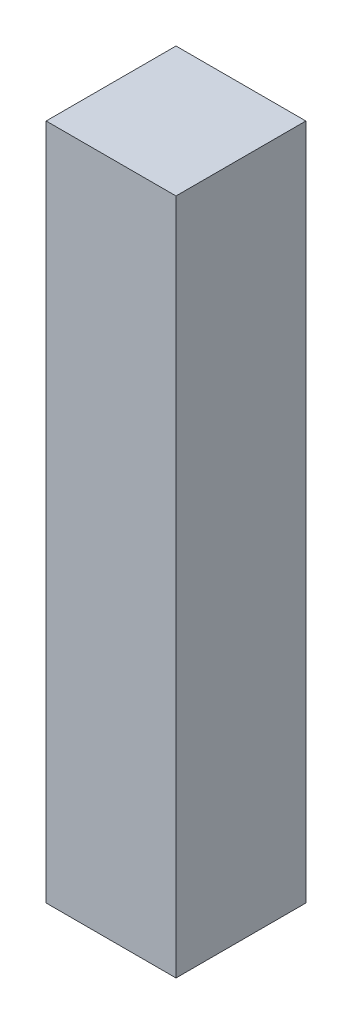
ISO-10303-21;
HEADER;
FILE_DESCRIPTION(('STEP AP214'),'2;1');
FILE_NAME('part.step','',(''),(''),'','','');
FILE_SCHEMA(('AUTOMOTIVE_DESIGN { 1 0 10303 214 1 1 1 1 }'));
ENDSEC;
DATA;
#1=APPLICATION_CONTEXT('core data for automotive mechanical design processes');
#2=APPLICATION_PROTOCOL_DEFINITION('international standard','automotive_design',2000,#1);
#3=PRODUCT_CONTEXT('',#1,'mechanical');
#4=PRODUCT('Part','Part','',(#3));
#5=PRODUCT_RELATED_PRODUCT_CATEGORY('part','',(#4));
#6=PRODUCT_DEFINITION_FORMATION('','',#4);
#7=PRODUCT_DEFINITION_CONTEXT('part definition',#1,'design');
#8=PRODUCT_DEFINITION('design','',#6,#7);
#9=PRODUCT_DEFINITION_SHAPE('','',#8);
#10=(LENGTH_UNIT() NAMED_UNIT(*) SI_UNIT(.MILLI.,.METRE.));
#11=(NAMED_UNIT(*) PLANE_ANGLE_UNIT() SI_UNIT($,.RADIAN.));
#12=(NAMED_UNIT(*) SI_UNIT($,.STERADIAN.) SOLID_ANGLE_UNIT());
#13=UNCERTAINTY_MEASURE_WITH_UNIT(LENGTH_MEASURE(1.E-05),#10,'distance_accuracy_value','');
#14=(GEOMETRIC_REPRESENTATION_CONTEXT(3) GLOBAL_UNCERTAINTY_ASSIGNED_CONTEXT((#13)) GLOBAL_UNIT_ASSIGNED_CONTEXT((#10,
#11,#12)) REPRESENTATION_CONTEXT('',''));
#15=CARTESIAN_POINT('',(0.,0.,0.));
#16=DIRECTION('',(0.,0.,1.));
#17=DIRECTION('',(1.,0.,0.));
#18=AXIS2_PLACEMENT_3D('',#15,#16,#17);
#19=CARTESIAN_POINT('',(0.,41.2,0.));
#20=DIRECTION('',(1.,0.,0.));
#21=DIRECTION('',(0.,0.,-1.));
#22=AXIS2_PLACEMENT_3D('',#19,#20,#21);
#23=PLANE('',#22);
#24=DIRECTION('',(0.,0.,1.));
#25=VECTOR('',#24,1.);
#26=CARTESIAN_POINT('',(0.,0.,0.));
#27=LINE('',#26,#25);
#28=CARTESIAN_POINT('',(0.,0.,-7.9));
#29=VERTEX_POINT('',#28);
#30=CARTESIAN_POINT('',(0.,0.,0.));
#31=VERTEX_POINT('',#30);
#32=EDGE_CURVE('E97',#29,#31,#27,.T.);
#33=ORIENTED_EDGE('',*,*,#32,.T.);
#34=DIRECTION('',(0.,-1.,0.));
#35=VECTOR('',#34,1.);
#36=CARTESIAN_POINT('',(0.,41.2,0.));
#37=LINE('',#36,#35);
#38=CARTESIAN_POINT('',(0.,41.2,0.));
#39=VERTEX_POINT('',#38);
#40=EDGE_CURVE('E11',#39,#31,#37,.T.);
#41=ORIENTED_EDGE('',*,*,#40,.F.);
#42=DIRECTION('',(0.,0.,1.));
#43=VECTOR('',#42,1.);
#44=CARTESIAN_POINT('',(0.,41.2,0.));
#45=LINE('',#44,#43);
#46=CARTESIAN_POINT('',(0.,41.2,-7.9));
#47=VERTEX_POINT('',#46);
#48=EDGE_CURVE('E85',#47,#39,#45,.T.);
#49=ORIENTED_EDGE('',*,*,#48,.F.);
#50=DIRECTION('',(0.,-1.,0.));
#51=VECTOR('',#50,1.);
#52=CARTESIAN_POINT('',(0.,41.2,-7.9));
#53=LINE('',#52,#51);
#54=EDGE_CURVE('E93',#47,#29,#53,.T.);
#55=ORIENTED_EDGE('',*,*,#54,.T.);
#56=EDGE_LOOP('',(#33,#41,#49,#55));
#57=FACE_BOUND('',#56,.T.);
#58=ADVANCED_FACE('F34',(#57),#23,.F.);
#59=CARTESIAN_POINT('',(0.,41.2,0.));
#60=DIRECTION('',(0.,0.,-1.));
#61=DIRECTION('',(-1.,0.,0.));
#62=AXIS2_PLACEMENT_3D('',#59,#60,#61);
#63=PLANE('',#62);
#64=DIRECTION('',(1.,0.,0.));
#65=VECTOR('',#64,1.);
#66=CARTESIAN_POINT('',(0.,0.,0.));
#67=LINE('',#66,#65);
#68=CARTESIAN_POINT('',(7.9,0.,0.));
#69=VERTEX_POINT('',#68);
#70=EDGE_CURVE('E89',#31,#69,#67,.T.);
#71=ORIENTED_EDGE('',*,*,#70,.T.);
#72=DIRECTION('',(0.,-1.,0.));
#73=VECTOR('',#72,1.);
#74=CARTESIAN_POINT('',(7.9,41.2,0.));
#75=LINE('',#74,#73);
#76=CARTESIAN_POINT('',(7.9,41.2,0.));
#77=VERTEX_POINT('',#76);
#78=EDGE_CURVE('E42',#77,#69,#75,.T.);
#79=ORIENTED_EDGE('',*,*,#78,.F.);
#80=DIRECTION('',(1.,0.,0.));
#81=VECTOR('',#80,1.);
#82=CARTESIAN_POINT('',(0.,41.2,0.));
#83=LINE('',#82,#81);
#84=EDGE_CURVE('E80',#39,#77,#83,.T.);
#85=ORIENTED_EDGE('',*,*,#84,.F.);
#86=ORIENTED_EDGE('',*,*,#40,.T.);
#87=EDGE_LOOP('',(#71,#79,#85,#86));
#88=FACE_BOUND('',#87,.T.);
#89=ADVANCED_FACE('F88',(#88),#63,.F.);
#90=CARTESIAN_POINT('',(7.9,41.2,0.));
#91=DIRECTION('',(-1.,0.,0.));
#92=DIRECTION('',(0.,0.,1.));
#93=AXIS2_PLACEMENT_3D('',#90,#91,#92);
#94=PLANE('',#93);
#95=DIRECTION('',(0.,0.,-1.));
#96=VECTOR('',#95,1.);
#97=CARTESIAN_POINT('',(7.9,0.,0.));
#98=LINE('',#97,#96);
#99=CARTESIAN_POINT('',(7.9,0.,-7.9));
#100=VERTEX_POINT('',#99);
#101=EDGE_CURVE('E67',#69,#100,#98,.T.);
#102=ORIENTED_EDGE('',*,*,#101,.T.);
#103=DIRECTION('',(0.,-1.,0.));
#104=VECTOR('',#103,1.);
#105=CARTESIAN_POINT('',(7.9,41.2,-7.9));
#106=LINE('',#105,#104);
#107=CARTESIAN_POINT('',(7.9,41.2,-7.9));
#108=VERTEX_POINT('',#107);
#109=EDGE_CURVE('E90',#108,#100,#106,.T.);
#110=ORIENTED_EDGE('',*,*,#109,.F.);
#111=DIRECTION('',(0.,0.,-1.));
#112=VECTOR('',#111,1.);
#113=CARTESIAN_POINT('',(7.9,41.2,0.));
#114=LINE('',#113,#112);
#115=EDGE_CURVE('E83',#77,#108,#114,.T.);
#116=ORIENTED_EDGE('',*,*,#115,.F.);
#117=ORIENTED_EDGE('',*,*,#78,.T.);
#118=EDGE_LOOP('',(#102,#110,#116,#117));
#119=FACE_BOUND('',#118,.T.);
#120=ADVANCED_FACE('F91',(#119),#94,.F.);
#121=CARTESIAN_POINT('',(0.,41.2,-7.9));
#122=DIRECTION('',(0.,0.,1.));
#123=DIRECTION('',(1.,0.,0.));
#124=AXIS2_PLACEMENT_3D('',#121,#122,#123);
#125=PLANE('',#124);
#126=DIRECTION('',(-1.,0.,0.));
#127=VECTOR('',#126,1.);
#128=CARTESIAN_POINT('',(0.,0.,-7.9));
#129=LINE('',#128,#127);
#130=EDGE_CURVE('E73',#100,#29,#129,.T.);
#131=ORIENTED_EDGE('',*,*,#130,.T.);
#132=ORIENTED_EDGE('',*,*,#54,.F.);
#133=DIRECTION('',(-1.,0.,0.));
#134=VECTOR('',#133,1.);
#135=CARTESIAN_POINT('',(0.,41.2,-7.9));
#136=LINE('',#135,#134);
#137=EDGE_CURVE('E50',#108,#47,#136,.T.);
#138=ORIENTED_EDGE('',*,*,#137,.F.);
#139=ORIENTED_EDGE('',*,*,#109,.T.);
#140=EDGE_LOOP('',(#131,#132,#138,#139));
#141=FACE_BOUND('',#140,.T.);
#142=ADVANCED_FACE('F104',(#141),#125,.F.);
#143=CARTESIAN_POINT('',(0.,41.2,0.));
#144=DIRECTION('',(0.,-1.,0.));
#145=DIRECTION('',(0.,0.,-1.));
#146=AXIS2_PLACEMENT_3D('',#143,#144,#145);
#147=PLANE('',#146);
#148=ORIENTED_EDGE('',*,*,#48,.T.);
#149=ORIENTED_EDGE('',*,*,#84,.T.);
#150=ORIENTED_EDGE('',*,*,#115,.T.);
#151=ORIENTED_EDGE('',*,*,#137,.T.);
#152=EDGE_LOOP('',(#148,#149,#150,#151));
#153=FACE_BOUND('',#152,.T.);
#154=ADVANCED_FACE('F81',(#153),#147,.F.);
#155=CARTESIAN_POINT('',(0.,0.,0.));
#156=DIRECTION('',(0.,-1.,0.));
#157=DIRECTION('',(0.,0.,-1.));
#158=AXIS2_PLACEMENT_3D('',#155,#156,#157);
#159=PLANE('',#158);
#160=ORIENTED_EDGE('',*,*,#32,.F.);
#161=ORIENTED_EDGE('',*,*,#130,.F.);
#162=ORIENTED_EDGE('',*,*,#101,.F.);
#163=ORIENTED_EDGE('',*,*,#70,.F.);
#164=EDGE_LOOP('',(#160,#161,#162,#163));
#165=FACE_BOUND('',#164,.T.);
#166=ADVANCED_FACE('F107',(#165),#159,.T.);
#167=CLOSED_SHELL('',(#58,#89,#120,#142,#154,#166));
#168=MANIFOLD_SOLID_BREP('B2',#167);
#169=ADVANCED_BREP_SHAPE_REPRESENTATION('',(#18,#168),#14);
#170=SHAPE_DEFINITION_REPRESENTATION(#9,#169);
ENDSEC;
END-ISO-10303-21;
